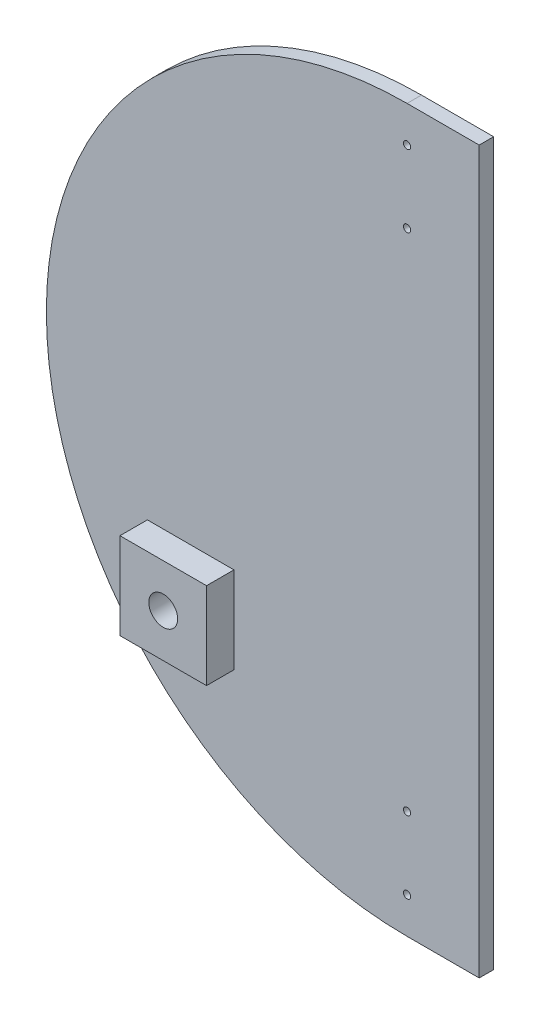
ISO-10303-21;
HEADER;
FILE_DESCRIPTION(('STEP AP214'),'2;1');
FILE_NAME('part.step','',(''),(''),'','','');
FILE_SCHEMA(('AUTOMOTIVE_DESIGN { 1 0 10303 214 1 1 1 1 }'));
ENDSEC;
DATA;
#1=APPLICATION_CONTEXT('core data for automotive mechanical design processes');
#2=APPLICATION_PROTOCOL_DEFINITION('international standard','automotive_design',2000,#1);
#3=PRODUCT_CONTEXT('',#1,'mechanical');
#4=PRODUCT('Part','Part','',(#3));
#5=PRODUCT_RELATED_PRODUCT_CATEGORY('part','',(#4));
#6=PRODUCT_DEFINITION_FORMATION('','',#4);
#7=PRODUCT_DEFINITION_CONTEXT('part definition',#1,'design');
#8=PRODUCT_DEFINITION('design','',#6,#7);
#9=PRODUCT_DEFINITION_SHAPE('','',#8);
#10=(LENGTH_UNIT() NAMED_UNIT(*) SI_UNIT(.MILLI.,.METRE.));
#11=(NAMED_UNIT(*) PLANE_ANGLE_UNIT() SI_UNIT($,.RADIAN.));
#12=(NAMED_UNIT(*) SI_UNIT($,.STERADIAN.) SOLID_ANGLE_UNIT());
#13=UNCERTAINTY_MEASURE_WITH_UNIT(LENGTH_MEASURE(1.E-05),#10,'distance_accuracy_value','');
#14=(GEOMETRIC_REPRESENTATION_CONTEXT(3) GLOBAL_UNCERTAINTY_ASSIGNED_CONTEXT((#13)) GLOBAL_UNIT_ASSIGNED_CONTEXT((#10,
#11,#12)) REPRESENTATION_CONTEXT('',''));
#15=CARTESIAN_POINT('',(0.,0.,0.));
#16=DIRECTION('',(0.,0.,1.));
#17=DIRECTION('',(1.,0.,0.));
#18=AXIS2_PLACEMENT_3D('',#15,#16,#17);
#19=CARTESIAN_POINT('',(0.,0.,5.));
#20=DIRECTION('',(0.,0.,1.));
#21=DIRECTION('',(1.,0.,0.));
#22=AXIS2_PLACEMENT_3D('',#19,#20,#21);
#23=PLANE('',#22);
#24=CARTESIAN_POINT('',(0.,-87.5,5.));
#25=DIRECTION('',(0.,0.,1.));
#26=DIRECTION('',(-1.,0.,0.));
#27=AXIS2_PLACEMENT_3D('',#24,#25,#26);
#28=CIRCLE('',#27,1.25);
#29=CARTESIAN_POINT('',(-1.25,-87.5,5.));
#30=VERTEX_POINT('',#29);
#31=EDGE_CURVE('E154',#30,#30,#28,.T.);
#32=ORIENTED_EDGE('',*,*,#31,.F.);
#33=EDGE_LOOP('',(#32));
#34=FACE_BOUND('',#33,.T.);
#35=CARTESIAN_POINT('',(0.,112.5,5.));
#36=DIRECTION('',(0.,0.,1.));
#37=DIRECTION('',(1.,0.,0.));
#38=AXIS2_PLACEMENT_3D('',#35,#36,#37);
#39=CIRCLE('',#38,1.25);
#40=CARTESIAN_POINT('',(1.25,112.5,5.));
#41=VERTEX_POINT('',#40);
#42=EDGE_CURVE('E166',#41,#41,#39,.T.);
#43=ORIENTED_EDGE('',*,*,#42,.F.);
#44=EDGE_LOOP('',(#43));
#45=FACE_BOUND('',#44,.T.);
#46=DIRECTION('',(0.,1.,0.));
#47=VECTOR('',#46,1.);
#48=CARTESIAN_POINT('',(25.,125.,5.));
#49=LINE('',#48,#47);
#50=CARTESIAN_POINT('',(25.,-125.,5.));
#51=VERTEX_POINT('',#50);
#52=CARTESIAN_POINT('',(25.,125.,5.));
#53=VERTEX_POINT('',#52);
#54=EDGE_CURVE('E172',#51,#53,#49,.T.);
#55=ORIENTED_EDGE('',*,*,#54,.T.);
#56=DIRECTION('',(-1.,0.,0.));
#57=VECTOR('',#56,1.);
#58=CARTESIAN_POINT('',(0.,125.,5.));
#59=LINE('',#58,#57);
#60=CARTESIAN_POINT('',(0.,125.,5.));
#61=VERTEX_POINT('',#60);
#62=EDGE_CURVE('E93',#53,#61,#59,.T.);
#63=ORIENTED_EDGE('',*,*,#62,.T.);
#64=CARTESIAN_POINT('',(0.,0.,5.));
#65=DIRECTION('',(0.,0.,1.));
#66=DIRECTION('',(1.,0.,0.));
#67=AXIS2_PLACEMENT_3D('',#64,#65,#66);
#68=CIRCLE('',#67,125.);
#69=CARTESIAN_POINT('',(0.,-125.,5.));
#70=VERTEX_POINT('',#69);
#71=EDGE_CURVE('E175',#61,#70,#68,.T.);
#72=ORIENTED_EDGE('',*,*,#71,.T.);
#73=DIRECTION('',(1.,0.,0.));
#74=VECTOR('',#73,1.);
#75=CARTESIAN_POINT('',(25.,-125.,5.));
#76=LINE('',#75,#74);
#77=EDGE_CURVE('E65',#70,#51,#76,.T.);
#78=ORIENTED_EDGE('',*,*,#77,.T.);
#79=EDGE_LOOP('',(#55,#63,#72,#78));
#80=FACE_BOUND('',#79,.T.);
#81=CARTESIAN_POINT('',(0.,87.5,5.));
#82=DIRECTION('',(0.,0.,1.));
#83=DIRECTION('',(1.,0.,0.));
#84=AXIS2_PLACEMENT_3D('',#81,#82,#83);
#85=CIRCLE('',#84,1.25);
#86=CARTESIAN_POINT('',(1.25,87.5,5.));
#87=VERTEX_POINT('',#86);
#88=EDGE_CURVE('E160',#87,#87,#85,.T.);
#89=ORIENTED_EDGE('',*,*,#88,.F.);
#90=EDGE_LOOP('',(#89));
#91=FACE_BOUND('',#90,.T.);
#92=CARTESIAN_POINT('',(0.,-112.5,5.));
#93=DIRECTION('',(0.,0.,1.));
#94=DIRECTION('',(-1.,0.,0.));
#95=AXIS2_PLACEMENT_3D('',#92,#93,#94);
#96=CIRCLE('',#95,1.25);
#97=CARTESIAN_POINT('',(-1.25,-112.5,5.));
#98=VERTEX_POINT('',#97);
#99=EDGE_CURVE('E148',#98,#98,#96,.T.);
#100=ORIENTED_EDGE('',*,*,#99,.F.);
#101=EDGE_LOOP('',(#100));
#102=FACE_BOUND('',#101,.T.);
#103=DIRECTION('',(-1.,0.,0.));
#104=VECTOR('',#103,1.);
#105=CARTESIAN_POINT('',(-90.,-45.,5.));
#106=LINE('',#105,#104);
#107=CARTESIAN_POINT('',(-60.,-45.,5.));
#108=VERTEX_POINT('',#107);
#109=CARTESIAN_POINT('',(-90.,-45.,5.));
#110=VERTEX_POINT('',#109);
#111=EDGE_CURVE('E259',#108,#110,#106,.T.);
#112=ORIENTED_EDGE('',*,*,#111,.F.);
#113=DIRECTION('',(0.,1.,0.));
#114=VECTOR('',#113,1.);
#115=CARTESIAN_POINT('',(-60.,-75.,5.));
#116=LINE('',#115,#114);
#117=CARTESIAN_POINT('',(-60.,-75.,5.));
#118=VERTEX_POINT('',#117);
#119=EDGE_CURVE('E138',#118,#108,#116,.T.);
#120=ORIENTED_EDGE('',*,*,#119,.F.);
#121=DIRECTION('',(1.,0.,0.));
#122=VECTOR('',#121,1.);
#123=CARTESIAN_POINT('',(-90.,-75.,5.));
#124=LINE('',#123,#122);
#125=CARTESIAN_POINT('',(-90.,-75.,5.));
#126=VERTEX_POINT('',#125);
#127=EDGE_CURVE('E134',#126,#118,#124,.T.);
#128=ORIENTED_EDGE('',*,*,#127,.F.);
#129=DIRECTION('',(0.,-1.,0.));
#130=VECTOR('',#129,1.);
#131=CARTESIAN_POINT('',(-90.,-75.,5.));
#132=LINE('',#131,#130);
#133=EDGE_CURVE('E266',#110,#126,#132,.T.);
#134=ORIENTED_EDGE('',*,*,#133,.F.);
#135=EDGE_LOOP('',(#112,#120,#128,#134));
#136=FACE_BOUND('',#135,.T.);
#137=ADVANCED_FACE('F41',(#34,#45,#80,#91,#102,#136),#23,.T.);
#138=CARTESIAN_POINT('',(0.,0.,0.));
#139=DIRECTION('',(0.,0.,1.));
#140=DIRECTION('',(1.,0.,0.));
#141=AXIS2_PLACEMENT_3D('',#138,#139,#140);
#142=PLANE('',#141);
#143=DIRECTION('',(0.,1.,0.));
#144=VECTOR('',#143,1.);
#145=CARTESIAN_POINT('',(25.,125.,0.));
#146=LINE('',#145,#144);
#147=CARTESIAN_POINT('',(25.,-125.,0.));
#148=VERTEX_POINT('',#147);
#149=CARTESIAN_POINT('',(25.,125.,0.));
#150=VERTEX_POINT('',#149);
#151=EDGE_CURVE('E169',#148,#150,#146,.T.);
#152=ORIENTED_EDGE('',*,*,#151,.F.);
#153=DIRECTION('',(1.,0.,0.));
#154=VECTOR('',#153,1.);
#155=CARTESIAN_POINT('',(25.,-125.,0.));
#156=LINE('',#155,#154);
#157=CARTESIAN_POINT('',(0.,-125.,0.));
#158=VERTEX_POINT('',#157);
#159=EDGE_CURVE('E86',#158,#148,#156,.T.);
#160=ORIENTED_EDGE('',*,*,#159,.F.);
#161=CARTESIAN_POINT('',(0.,0.,0.));
#162=DIRECTION('',(0.,0.,1.));
#163=DIRECTION('',(1.,0.,0.));
#164=AXIS2_PLACEMENT_3D('',#161,#162,#163);
#165=CIRCLE('',#164,125.);
#166=CARTESIAN_POINT('',(0.,125.,0.));
#167=VERTEX_POINT('',#166);
#168=EDGE_CURVE('E183',#167,#158,#165,.T.);
#169=ORIENTED_EDGE('',*,*,#168,.F.);
#170=DIRECTION('',(-1.,0.,0.));
#171=VECTOR('',#170,1.);
#172=CARTESIAN_POINT('',(0.,125.,0.));
#173=LINE('',#172,#171);
#174=EDGE_CURVE('E181',#150,#167,#173,.T.);
#175=ORIENTED_EDGE('',*,*,#174,.F.);
#176=EDGE_LOOP('',(#152,#160,#169,#175));
#177=FACE_BOUND('',#176,.T.);
#178=CARTESIAN_POINT('',(0.,112.5,0.));
#179=DIRECTION('',(0.,0.,1.));
#180=DIRECTION('',(1.,0.,0.));
#181=AXIS2_PLACEMENT_3D('',#178,#179,#180);
#182=CIRCLE('',#181,1.25);
#183=CARTESIAN_POINT('',(1.25,112.5,0.));
#184=VERTEX_POINT('',#183);
#185=EDGE_CURVE('E163',#184,#184,#182,.T.);
#186=ORIENTED_EDGE('',*,*,#185,.T.);
#187=EDGE_LOOP('',(#186));
#188=FACE_BOUND('',#187,.T.);
#189=CARTESIAN_POINT('',(0.,87.5,0.));
#190=DIRECTION('',(0.,0.,1.));
#191=DIRECTION('',(1.,0.,0.));
#192=AXIS2_PLACEMENT_3D('',#189,#190,#191);
#193=CIRCLE('',#192,1.25);
#194=CARTESIAN_POINT('',(1.25,87.5,0.));
#195=VERTEX_POINT('',#194);
#196=EDGE_CURVE('E157',#195,#195,#193,.T.);
#197=ORIENTED_EDGE('',*,*,#196,.T.);
#198=EDGE_LOOP('',(#197));
#199=FACE_BOUND('',#198,.T.);
#200=CARTESIAN_POINT('',(0.,-87.5,0.));
#201=DIRECTION('',(0.,0.,1.));
#202=DIRECTION('',(-1.,0.,0.));
#203=AXIS2_PLACEMENT_3D('',#200,#201,#202);
#204=CIRCLE('',#203,1.25);
#205=CARTESIAN_POINT('',(-1.25,-87.5,0.));
#206=VERTEX_POINT('',#205);
#207=EDGE_CURVE('E151',#206,#206,#204,.T.);
#208=ORIENTED_EDGE('',*,*,#207,.T.);
#209=EDGE_LOOP('',(#208));
#210=FACE_BOUND('',#209,.T.);
#211=CARTESIAN_POINT('',(0.,-112.5,0.));
#212=DIRECTION('',(0.,0.,1.));
#213=DIRECTION('',(-1.,0.,0.));
#214=AXIS2_PLACEMENT_3D('',#211,#212,#213);
#215=CIRCLE('',#214,1.25);
#216=CARTESIAN_POINT('',(-1.25,-112.5,0.));
#217=VERTEX_POINT('',#216);
#218=EDGE_CURVE('E143',#217,#217,#215,.T.);
#219=ORIENTED_EDGE('',*,*,#218,.T.);
#220=EDGE_LOOP('',(#219));
#221=FACE_BOUND('',#220,.T.);
#222=CARTESIAN_POINT('',(-75.,-60.,0.));
#223=DIRECTION('',(0.,0.,1.));
#224=DIRECTION('',(1.,0.,0.));
#225=AXIS2_PLACEMENT_3D('',#222,#223,#224);
#226=CIRCLE('',#225,5.00000000000001);
#227=CARTESIAN_POINT('',(-70.,-60.,0.));
#228=VERTEX_POINT('',#227);
#229=EDGE_CURVE('E140',#228,#228,#226,.T.);
#230=ORIENTED_EDGE('',*,*,#229,.T.);
#231=EDGE_LOOP('',(#230));
#232=FACE_BOUND('',#231,.T.);
#233=ADVANCED_FACE('F196',(#177,#188,#199,#210,#221,#232),#142,.F.);
#234=CARTESIAN_POINT('',(25.,125.,5.));
#235=DIRECTION('',(-1.,0.,0.));
#236=DIRECTION('',(0.,0.,1.));
#237=AXIS2_PLACEMENT_3D('',#234,#235,#236);
#238=PLANE('',#237);
#239=ORIENTED_EDGE('',*,*,#151,.T.);
#240=DIRECTION('',(0.,0.,-1.));
#241=VECTOR('',#240,1.);
#242=CARTESIAN_POINT('',(25.,125.,5.));
#243=LINE('',#242,#241);
#244=EDGE_CURVE('E11',#53,#150,#243,.T.);
#245=ORIENTED_EDGE('',*,*,#244,.F.);
#246=ORIENTED_EDGE('',*,*,#54,.F.);
#247=DIRECTION('',(0.,0.,-1.));
#248=VECTOR('',#247,1.);
#249=CARTESIAN_POINT('',(25.,-125.,5.));
#250=LINE('',#249,#248);
#251=EDGE_CURVE('E178',#51,#148,#250,.T.);
#252=ORIENTED_EDGE('',*,*,#251,.T.);
#253=EDGE_LOOP('',(#239,#245,#246,#252));
#254=FACE_BOUND('',#253,.T.);
#255=ADVANCED_FACE('F43',(#254),#238,.F.);
#256=CARTESIAN_POINT('',(0.,125.,5.));
#257=DIRECTION('',(0.,-1.,0.));
#258=DIRECTION('',(0.,0.,-1.));
#259=AXIS2_PLACEMENT_3D('',#256,#257,#258);
#260=PLANE('',#259);
#261=ORIENTED_EDGE('',*,*,#174,.T.);
#262=DIRECTION('',(0.,0.,-1.));
#263=VECTOR('',#262,1.);
#264=CARTESIAN_POINT('',(0.,125.,5.));
#265=LINE('',#264,#263);
#266=EDGE_CURVE('E49',#61,#167,#265,.T.);
#267=ORIENTED_EDGE('',*,*,#266,.F.);
#268=ORIENTED_EDGE('',*,*,#62,.F.);
#269=ORIENTED_EDGE('',*,*,#244,.T.);
#270=EDGE_LOOP('',(#261,#267,#268,#269));
#271=FACE_BOUND('',#270,.T.);
#272=ADVANCED_FACE('F212',(#271),#260,.F.);
#273=CARTESIAN_POINT('',(0.,0.,5.));
#274=DIRECTION('',(0.,0.,-1.));
#275=DIRECTION('',(-1.,0.,0.));
#276=AXIS2_PLACEMENT_3D('',#273,#274,#275);
#277=CYLINDRICAL_SURFACE('',#276,125.);
#278=ORIENTED_EDGE('',*,*,#168,.T.);
#279=DIRECTION('',(0.,0.,-1.));
#280=VECTOR('',#279,1.);
#281=CARTESIAN_POINT('',(0.,-125.,5.));
#282=LINE('',#281,#280);
#283=EDGE_CURVE('E187',#70,#158,#282,.T.);
#284=ORIENTED_EDGE('',*,*,#283,.F.);
#285=ORIENTED_EDGE('',*,*,#71,.F.);
#286=ORIENTED_EDGE('',*,*,#266,.T.);
#287=EDGE_LOOP('',(#278,#284,#285,#286));
#288=FACE_BOUND('',#287,.T.);
#289=ADVANCED_FACE('F192',(#288),#277,.T.);
#290=CARTESIAN_POINT('',(25.,-125.,5.));
#291=DIRECTION('',(0.,1.,0.));
#292=DIRECTION('',(0.,0.,1.));
#293=AXIS2_PLACEMENT_3D('',#290,#291,#292);
#294=PLANE('',#293);
#295=ORIENTED_EDGE('',*,*,#159,.T.);
#296=ORIENTED_EDGE('',*,*,#251,.F.);
#297=ORIENTED_EDGE('',*,*,#77,.F.);
#298=ORIENTED_EDGE('',*,*,#283,.T.);
#299=EDGE_LOOP('',(#295,#296,#297,#298));
#300=FACE_BOUND('',#299,.T.);
#301=ADVANCED_FACE('F201',(#300),#294,.F.);
#302=CARTESIAN_POINT('',(0.,112.5,5.));
#303=DIRECTION('',(0.,0.,-1.));
#304=DIRECTION('',(-1.,0.,0.));
#305=AXIS2_PLACEMENT_3D('',#302,#303,#304);
#306=CYLINDRICAL_SURFACE('',#305,1.25);
#307=ORIENTED_EDGE('',*,*,#42,.T.);
#308=EDGE_LOOP('',(#307));
#309=FACE_BOUND('',#308,.T.);
#310=ORIENTED_EDGE('',*,*,#185,.F.);
#311=EDGE_LOOP('',(#310));
#312=FACE_BOUND('',#311,.T.);
#313=ADVANCED_FACE('F203',(#309,#312),#306,.F.);
#314=CARTESIAN_POINT('',(0.,87.5,5.));
#315=DIRECTION('',(0.,0.,-1.));
#316=DIRECTION('',(-1.,0.,0.));
#317=AXIS2_PLACEMENT_3D('',#314,#315,#316);
#318=CYLINDRICAL_SURFACE('',#317,1.25);
#319=ORIENTED_EDGE('',*,*,#88,.T.);
#320=EDGE_LOOP('',(#319));
#321=FACE_BOUND('',#320,.T.);
#322=ORIENTED_EDGE('',*,*,#196,.F.);
#323=EDGE_LOOP('',(#322));
#324=FACE_BOUND('',#323,.T.);
#325=ADVANCED_FACE('F209',(#321,#324),#318,.F.);
#326=CARTESIAN_POINT('',(0.,-87.5,5.));
#327=DIRECTION('',(0.,0.,-1.));
#328=DIRECTION('',(-1.,0.,0.));
#329=AXIS2_PLACEMENT_3D('',#326,#327,#328);
#330=CYLINDRICAL_SURFACE('',#329,1.25);
#331=ORIENTED_EDGE('',*,*,#31,.T.);
#332=EDGE_LOOP('',(#331));
#333=FACE_BOUND('',#332,.T.);
#334=ORIENTED_EDGE('',*,*,#207,.F.);
#335=EDGE_LOOP('',(#334));
#336=FACE_BOUND('',#335,.T.);
#337=ADVANCED_FACE('F226',(#333,#336),#330,.F.);
#338=CARTESIAN_POINT('',(0.,-112.5,5.));
#339=DIRECTION('',(0.,0.,-1.));
#340=DIRECTION('',(-1.,0.,0.));
#341=AXIS2_PLACEMENT_3D('',#338,#339,#340);
#342=CYLINDRICAL_SURFACE('',#341,1.25);
#343=ORIENTED_EDGE('',*,*,#99,.T.);
#344=EDGE_LOOP('',(#343));
#345=FACE_BOUND('',#344,.T.);
#346=ORIENTED_EDGE('',*,*,#218,.F.);
#347=EDGE_LOOP('',(#346));
#348=FACE_BOUND('',#347,.T.);
#349=ADVANCED_FACE('F230',(#345,#348),#342,.F.);
#350=CARTESIAN_POINT('',(-75.,-60.,5.));
#351=DIRECTION('',(0.,0.,-1.));
#352=DIRECTION('',(-1.,0.,0.));
#353=AXIS2_PLACEMENT_3D('',#350,#351,#352);
#354=CYLINDRICAL_SURFACE('',#353,5.00000000000001);
#355=ORIENTED_EDGE('',*,*,#229,.F.);
#356=EDGE_LOOP('',(#355));
#357=FACE_BOUND('',#356,.T.);
#358=CARTESIAN_POINT('',(-75.,-60.,14.5));
#359=DIRECTION('',(0.,0.,-1.));
#360=DIRECTION('',(-1.,0.,0.));
#361=AXIS2_PLACEMENT_3D('',#358,#359,#360);
#362=CIRCLE('',#361,5.00000000000001);
#363=CARTESIAN_POINT('',(-80.,-60.,14.5));
#364=VERTEX_POINT('',#363);
#365=EDGE_CURVE('E256',#364,#364,#362,.T.);
#366=ORIENTED_EDGE('',*,*,#365,.F.);
#367=EDGE_LOOP('',(#366));
#368=FACE_BOUND('',#367,.T.);
#369=ADVANCED_FACE('F234',(#357,#368),#354,.F.);
#370=CARTESIAN_POINT('',(-60.,-75.,14.5));
#371=DIRECTION('',(-1.,0.,0.));
#372=DIRECTION('',(0.,0.,1.));
#373=AXIS2_PLACEMENT_3D('',#370,#371,#372);
#374=PLANE('',#373);
#375=ORIENTED_EDGE('',*,*,#119,.T.);
#376=DIRECTION('',(0.,0.,-1.));
#377=VECTOR('',#376,1.);
#378=CARTESIAN_POINT('',(-60.,-45.,14.5));
#379=LINE('',#378,#377);
#380=CARTESIAN_POINT('',(-60.,-45.,14.5));
#381=VERTEX_POINT('',#380);
#382=EDGE_CURVE('E119',#381,#108,#379,.T.);
#383=ORIENTED_EDGE('',*,*,#382,.F.);
#384=DIRECTION('',(0.,1.,0.));
#385=VECTOR('',#384,1.);
#386=CARTESIAN_POINT('',(-60.,-75.,14.5));
#387=LINE('',#386,#385);
#388=CARTESIAN_POINT('',(-60.,-75.,14.5));
#389=VERTEX_POINT('',#388);
#390=EDGE_CURVE('E126',#389,#381,#387,.T.);
#391=ORIENTED_EDGE('',*,*,#390,.F.);
#392=DIRECTION('',(0.,0.,-1.));
#393=VECTOR('',#392,1.);
#394=CARTESIAN_POINT('',(-60.,-75.,14.5));
#395=LINE('',#394,#393);
#396=EDGE_CURVE('E263',#389,#118,#395,.T.);
#397=ORIENTED_EDGE('',*,*,#396,.T.);
#398=EDGE_LOOP('',(#375,#383,#391,#397));
#399=FACE_BOUND('',#398,.T.);
#400=ADVANCED_FACE('F136',(#399),#374,.F.);
#401=CARTESIAN_POINT('',(-90.,-45.,14.5));
#402=DIRECTION('',(0.,-1.,0.));
#403=DIRECTION('',(0.,0.,-1.));
#404=AXIS2_PLACEMENT_3D('',#401,#402,#403);
#405=PLANE('',#404);
#406=ORIENTED_EDGE('',*,*,#111,.T.);
#407=DIRECTION('',(0.,0.,-1.));
#408=VECTOR('',#407,1.);
#409=CARTESIAN_POINT('',(-90.,-45.,14.5));
#410=LINE('',#409,#408);
#411=CARTESIAN_POINT('',(-90.,-45.,14.5));
#412=VERTEX_POINT('',#411);
#413=EDGE_CURVE('E122',#412,#110,#410,.T.);
#414=ORIENTED_EDGE('',*,*,#413,.F.);
#415=DIRECTION('',(-1.,0.,0.));
#416=VECTOR('',#415,1.);
#417=CARTESIAN_POINT('',(-90.,-45.,14.5));
#418=LINE('',#417,#416);
#419=EDGE_CURVE('E115',#381,#412,#418,.T.);
#420=ORIENTED_EDGE('',*,*,#419,.F.);
#421=ORIENTED_EDGE('',*,*,#382,.T.);
#422=EDGE_LOOP('',(#406,#414,#420,#421));
#423=FACE_BOUND('',#422,.T.);
#424=ADVANCED_FACE('F117',(#423),#405,.F.);
#425=CARTESIAN_POINT('',(-90.,-75.,14.5));
#426=DIRECTION('',(1.,0.,0.));
#427=DIRECTION('',(0.,0.,-1.));
#428=AXIS2_PLACEMENT_3D('',#425,#426,#427);
#429=PLANE('',#428);
#430=ORIENTED_EDGE('',*,*,#133,.T.);
#431=DIRECTION('',(0.,0.,-1.));
#432=VECTOR('',#431,1.);
#433=CARTESIAN_POINT('',(-90.,-75.,14.5));
#434=LINE('',#433,#432);
#435=CARTESIAN_POINT('',(-90.,-75.,14.5));
#436=VERTEX_POINT('',#435);
#437=EDGE_CURVE('E56',#436,#126,#434,.T.);
#438=ORIENTED_EDGE('',*,*,#437,.F.);
#439=DIRECTION('',(0.,-1.,0.));
#440=VECTOR('',#439,1.);
#441=CARTESIAN_POINT('',(-90.,-75.,14.5));
#442=LINE('',#441,#440);
#443=EDGE_CURVE('E125',#412,#436,#442,.T.);
#444=ORIENTED_EDGE('',*,*,#443,.F.);
#445=ORIENTED_EDGE('',*,*,#413,.T.);
#446=EDGE_LOOP('',(#430,#438,#444,#445));
#447=FACE_BOUND('',#446,.T.);
#448=ADVANCED_FACE('F243',(#447),#429,.F.);
#449=CARTESIAN_POINT('',(-90.,-75.,14.5));
#450=DIRECTION('',(0.,1.,0.));
#451=DIRECTION('',(0.,0.,1.));
#452=AXIS2_PLACEMENT_3D('',#449,#450,#451);
#453=PLANE('',#452);
#454=ORIENTED_EDGE('',*,*,#127,.T.);
#455=ORIENTED_EDGE('',*,*,#396,.F.);
#456=DIRECTION('',(1.,0.,0.));
#457=VECTOR('',#456,1.);
#458=CARTESIAN_POINT('',(-90.,-75.,14.5));
#459=LINE('',#458,#457);
#460=EDGE_CURVE('E130',#436,#389,#459,.T.);
#461=ORIENTED_EDGE('',*,*,#460,.F.);
#462=ORIENTED_EDGE('',*,*,#437,.T.);
#463=EDGE_LOOP('',(#454,#455,#461,#462));
#464=FACE_BOUND('',#463,.T.);
#465=ADVANCED_FACE('F246',(#464),#453,.F.);
#466=CARTESIAN_POINT('',(0.,0.,14.5));
#467=DIRECTION('',(0.,0.,-1.));
#468=DIRECTION('',(-1.,0.,0.));
#469=AXIS2_PLACEMENT_3D('',#466,#467,#468);
#470=PLANE('',#469);
#471=ORIENTED_EDGE('',*,*,#365,.T.);
#472=EDGE_LOOP('',(#471));
#473=FACE_BOUND('',#472,.T.);
#474=ORIENTED_EDGE('',*,*,#390,.T.);
#475=ORIENTED_EDGE('',*,*,#419,.T.);
#476=ORIENTED_EDGE('',*,*,#443,.T.);
#477=ORIENTED_EDGE('',*,*,#460,.T.);
#478=EDGE_LOOP('',(#474,#475,#476,#477));
#479=FACE_BOUND('',#478,.T.);
#480=ADVANCED_FACE('F129',(#473,#479),#470,.F.);
#481=CLOSED_SHELL('',(#137,#233,#255,#272,#289,#301,#313,#325,#337,#349,#369,#400,#424,#448,
#465,#480));
#482=MANIFOLD_SOLID_BREP('B2',#481);
#483=ADVANCED_BREP_SHAPE_REPRESENTATION('',(#18,#482),#14);
#484=SHAPE_DEFINITION_REPRESENTATION(#9,#483);
ENDSEC;
END-ISO-10303-21;
